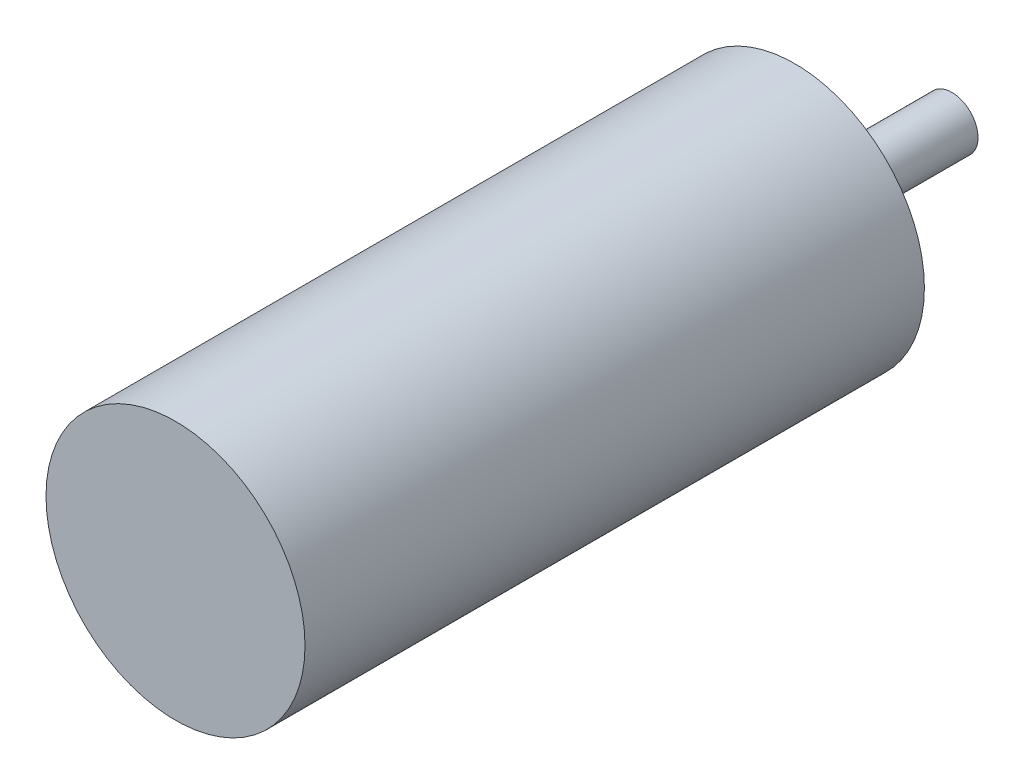
ISO-10303-21;
HEADER;
FILE_DESCRIPTION(('STEP AP214'),'2;1');
FILE_NAME('part.step','',(''),(''),'','','');
FILE_SCHEMA(('AUTOMOTIVE_DESIGN { 1 0 10303 214 1 1 1 1 }'));
ENDSEC;
DATA;
#1=APPLICATION_CONTEXT('core data for automotive mechanical design processes');
#2=APPLICATION_PROTOCOL_DEFINITION('international standard','automotive_design',2000,#1);
#3=PRODUCT_CONTEXT('',#1,'mechanical');
#4=PRODUCT('Part','Part','',(#3));
#5=PRODUCT_RELATED_PRODUCT_CATEGORY('part','',(#4));
#6=PRODUCT_DEFINITION_FORMATION('','',#4);
#7=PRODUCT_DEFINITION_CONTEXT('part definition',#1,'design');
#8=PRODUCT_DEFINITION('design','',#6,#7);
#9=PRODUCT_DEFINITION_SHAPE('','',#8);
#10=(LENGTH_UNIT() NAMED_UNIT(*) SI_UNIT(.MILLI.,.METRE.));
#11=(NAMED_UNIT(*) PLANE_ANGLE_UNIT() SI_UNIT($,.RADIAN.));
#12=(NAMED_UNIT(*) SI_UNIT($,.STERADIAN.) SOLID_ANGLE_UNIT());
#13=UNCERTAINTY_MEASURE_WITH_UNIT(LENGTH_MEASURE(1.E-05),#10,'distance_accuracy_value','');
#14=(GEOMETRIC_REPRESENTATION_CONTEXT(3) GLOBAL_UNCERTAINTY_ASSIGNED_CONTEXT((#13)) GLOBAL_UNIT_ASSIGNED_CONTEXT((#10,
#11,#12)) REPRESENTATION_CONTEXT('',''));
#15=CARTESIAN_POINT('',(0.,0.,0.));
#16=DIRECTION('',(0.,0.,1.));
#17=DIRECTION('',(1.,0.,0.));
#18=AXIS2_PLACEMENT_3D('',#15,#16,#17);
#19=CARTESIAN_POINT('',(0.,0.,-94.7));
#20=DIRECTION('',(0.,0.,1.));
#21=DIRECTION('',(1.,0.,0.));
#22=AXIS2_PLACEMENT_3D('',#19,#20,#21);
#23=CYLINDRICAL_SURFACE('',#22,19.8);
#24=CARTESIAN_POINT('',(0.,0.,-94.7));
#25=DIRECTION('',(0.,0.,1.));
#26=DIRECTION('',(1.,0.,0.));
#27=AXIS2_PLACEMENT_3D('',#24,#25,#26);
#28=CIRCLE('',#27,19.8);
#29=CARTESIAN_POINT('',(19.8,0.,-94.7));
#30=VERTEX_POINT('',#29);
#31=EDGE_CURVE('E42',#30,#30,#28,.T.);
#32=ORIENTED_EDGE('',*,*,#31,.T.);
#33=EDGE_LOOP('',(#32));
#34=FACE_BOUND('',#33,.T.);
#35=CARTESIAN_POINT('',(0.,0.,0.));
#36=DIRECTION('',(0.,0.,1.));
#37=DIRECTION('',(1.,0.,0.));
#38=AXIS2_PLACEMENT_3D('',#35,#36,#37);
#39=CIRCLE('',#38,19.8);
#40=CARTESIAN_POINT('',(19.8,0.,0.));
#41=VERTEX_POINT('',#40);
#42=EDGE_CURVE('E38',#41,#41,#39,.T.);
#43=ORIENTED_EDGE('',*,*,#42,.F.);
#44=EDGE_LOOP('',(#43));
#45=FACE_BOUND('',#44,.T.);
#46=ADVANCED_FACE('F35',(#34,#45),#23,.T.);
#47=CARTESIAN_POINT('',(0.,0.,-94.7));
#48=DIRECTION('',(0.,0.,1.));
#49=DIRECTION('',(1.,0.,0.));
#50=AXIS2_PLACEMENT_3D('',#47,#48,#49);
#51=PLANE('',#50);
#52=CARTESIAN_POINT('',(0.,0.,-94.7));
#53=DIRECTION('',(0.,0.,-1.));
#54=DIRECTION('',(-1.,0.,0.));
#55=AXIS2_PLACEMENT_3D('',#52,#53,#54);
#56=CIRCLE('',#55,4.);
#57=CARTESIAN_POINT('',(-4.,0.,-94.7));
#58=VERTEX_POINT('',#57);
#59=EDGE_CURVE('E10',#58,#58,#56,.T.);
#60=ORIENTED_EDGE('',*,*,#59,.F.);
#61=EDGE_LOOP('',(#60));
#62=FACE_BOUND('',#61,.T.);
#63=ORIENTED_EDGE('',*,*,#31,.F.);
#64=EDGE_LOOP('',(#63));
#65=FACE_BOUND('',#64,.T.);
#66=ADVANCED_FACE('F58',(#62,#65),#51,.F.);
#67=CARTESIAN_POINT('',(0.,0.,0.));
#68=DIRECTION('',(0.,0.,1.));
#69=DIRECTION('',(1.,0.,0.));
#70=AXIS2_PLACEMENT_3D('',#67,#68,#69);
#71=PLANE('',#70);
#72=ORIENTED_EDGE('',*,*,#42,.T.);
#73=EDGE_LOOP('',(#72));
#74=FACE_BOUND('',#73,.T.);
#75=ADVANCED_FACE('F55',(#74),#71,.T.);
#76=CARTESIAN_POINT('',(0.,0.,-118.7));
#77=DIRECTION('',(0.,0.,1.));
#78=DIRECTION('',(1.,0.,0.));
#79=AXIS2_PLACEMENT_3D('',#76,#77,#78);
#80=CYLINDRICAL_SURFACE('',#79,4.);
#81=CARTESIAN_POINT('',(0.,0.,-118.7));
#82=DIRECTION('',(0.,0.,-1.));
#83=DIRECTION('',(-1.,0.,0.));
#84=AXIS2_PLACEMENT_3D('',#81,#82,#83);
#85=CIRCLE('',#84,4.);
#86=CARTESIAN_POINT('',(-4.,0.,-118.7));
#87=VERTEX_POINT('',#86);
#88=EDGE_CURVE('E48',#87,#87,#85,.T.);
#89=ORIENTED_EDGE('',*,*,#88,.F.);
#90=EDGE_LOOP('',(#89));
#91=FACE_BOUND('',#90,.T.);
#92=ORIENTED_EDGE('',*,*,#59,.T.);
#93=EDGE_LOOP('',(#92));
#94=FACE_BOUND('',#93,.T.);
#95=ADVANCED_FACE('F70',(#91,#94),#80,.T.);
#96=CARTESIAN_POINT('',(0.,0.,-118.7));
#97=DIRECTION('',(0.,0.,-1.));
#98=DIRECTION('',(-1.,0.,0.));
#99=AXIS2_PLACEMENT_3D('',#96,#97,#98);
#100=PLANE('',#99);
#101=ORIENTED_EDGE('',*,*,#88,.T.);
#102=EDGE_LOOP('',(#101));
#103=FACE_BOUND('',#102,.T.);
#104=ADVANCED_FACE('F74',(#103),#100,.T.);
#105=CLOSED_SHELL('',(#46,#66,#75,#95,#104));
#106=MANIFOLD_SOLID_BREP('B2',#105);
#107=ADVANCED_BREP_SHAPE_REPRESENTATION('',(#18,#106),#14);
#108=SHAPE_DEFINITION_REPRESENTATION(#9,#107);
ENDSEC;
END-ISO-10303-21;
